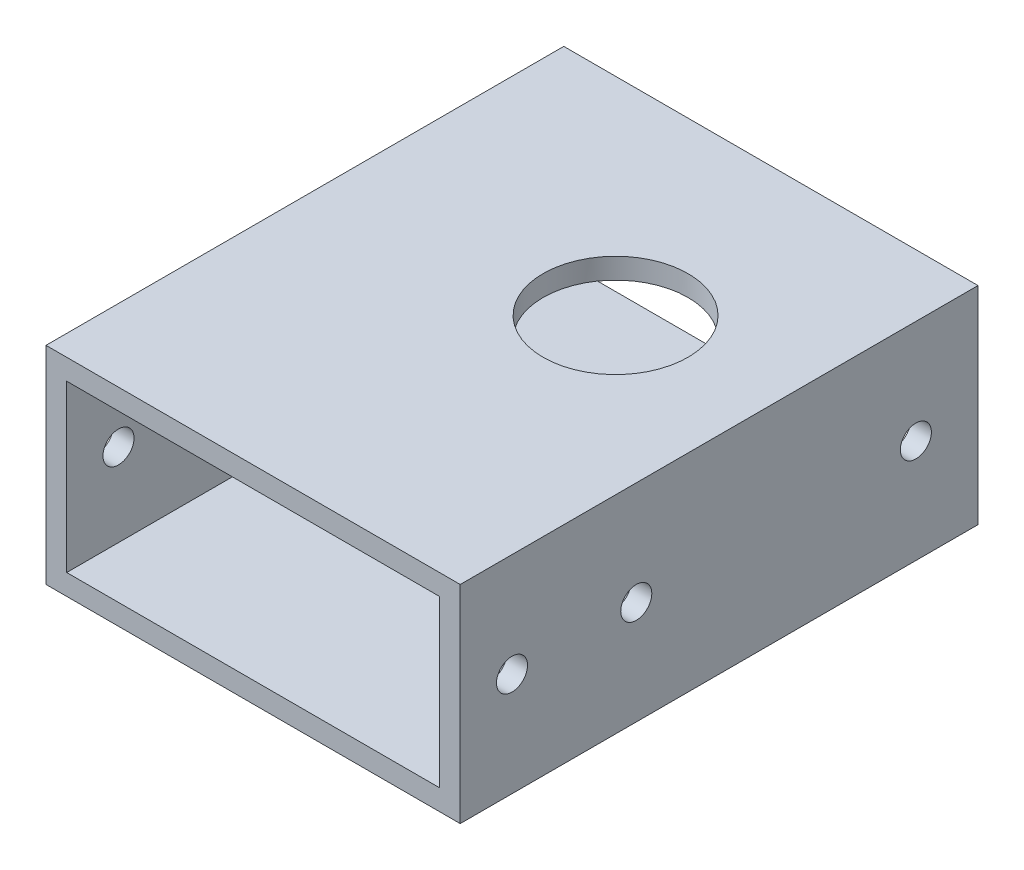
ISO-10303-21;
HEADER;
FILE_DESCRIPTION(('STEP AP214'),'2;1');
FILE_NAME('part.step','',(''),(''),'','','');
FILE_SCHEMA(('AUTOMOTIVE_DESIGN { 1 0 10303 214 1 1 1 1 }'));
ENDSEC;
DATA;
#1=APPLICATION_CONTEXT('core data for automotive mechanical design processes');
#2=APPLICATION_PROTOCOL_DEFINITION('international standard','automotive_design',2000,#1);
#3=PRODUCT_CONTEXT('',#1,'mechanical');
#4=PRODUCT('Part','Part','',(#3));
#5=PRODUCT_RELATED_PRODUCT_CATEGORY('part','',(#4));
#6=PRODUCT_DEFINITION_FORMATION('','',#4);
#7=PRODUCT_DEFINITION_CONTEXT('part definition',#1,'design');
#8=PRODUCT_DEFINITION('design','',#6,#7);
#9=PRODUCT_DEFINITION_SHAPE('','',#8);
#10=(LENGTH_UNIT() NAMED_UNIT(*) SI_UNIT(.MILLI.,.METRE.));
#11=(NAMED_UNIT(*) PLANE_ANGLE_UNIT() SI_UNIT($,.RADIAN.));
#12=(NAMED_UNIT(*) SI_UNIT($,.STERADIAN.) SOLID_ANGLE_UNIT());
#13=UNCERTAINTY_MEASURE_WITH_UNIT(LENGTH_MEASURE(1.E-05),#10,'distance_accuracy_value','');
#14=(GEOMETRIC_REPRESENTATION_CONTEXT(3) GLOBAL_UNCERTAINTY_ASSIGNED_CONTEXT((#13)) GLOBAL_UNIT_ASSIGNED_CONTEXT((#10,
#11,#12)) REPRESENTATION_CONTEXT('',''));
#15=CARTESIAN_POINT('',(0.,0.,0.));
#16=DIRECTION('',(0.,0.,1.));
#17=DIRECTION('',(1.,0.,0.));
#18=AXIS2_PLACEMENT_3D('',#15,#16,#17);
#19=CARTESIAN_POINT('',(0.,0.,50.));
#20=DIRECTION('',(0.,0.,1.));
#21=DIRECTION('',(1.,0.,0.));
#22=AXIS2_PLACEMENT_3D('',#19,#20,#21);
#23=PLANE('',#22);
#24=DIRECTION('',(0.,1.,0.));
#25=VECTOR('',#24,1.);
#26=CARTESIAN_POINT('',(20.,10.,50.));
#27=LINE('',#26,#25);
#28=CARTESIAN_POINT('',(20.,-10.,50.));
#29=VERTEX_POINT('',#28);
#30=CARTESIAN_POINT('',(20.,10.,50.));
#31=VERTEX_POINT('',#30);
#32=EDGE_CURVE('E148',#29,#31,#27,.T.);
#33=ORIENTED_EDGE('',*,*,#32,.T.);
#34=DIRECTION('',(-1.,0.,0.));
#35=VECTOR('',#34,1.);
#36=CARTESIAN_POINT('',(-20.,10.,50.));
#37=LINE('',#36,#35);
#38=CARTESIAN_POINT('',(-20.,10.,50.));
#39=VERTEX_POINT('',#38);
#40=EDGE_CURVE('E149',#31,#39,#37,.T.);
#41=ORIENTED_EDGE('',*,*,#40,.T.);
#42=DIRECTION('',(0.,-1.,0.));
#43=VECTOR('',#42,1.);
#44=CARTESIAN_POINT('',(-20.,10.,50.));
#45=LINE('',#44,#43);
#46=CARTESIAN_POINT('',(-20.,-10.,50.));
#47=VERTEX_POINT('',#46);
#48=EDGE_CURVE('E155',#39,#47,#45,.T.);
#49=ORIENTED_EDGE('',*,*,#48,.T.);
#50=DIRECTION('',(1.,0.,0.));
#51=VECTOR('',#50,1.);
#52=CARTESIAN_POINT('',(-20.,-10.,50.));
#53=LINE('',#52,#51);
#54=EDGE_CURVE('E152',#47,#29,#53,.T.);
#55=ORIENTED_EDGE('',*,*,#54,.T.);
#56=EDGE_LOOP('',(#33,#41,#49,#55));
#57=FACE_BOUND('',#56,.T.);
#58=DIRECTION('',(-1.,0.,0.));
#59=VECTOR('',#58,1.);
#60=CARTESIAN_POINT('',(-18.,8.,50.));
#61=LINE('',#60,#59);
#62=CARTESIAN_POINT('',(18.,8.,50.));
#63=VERTEX_POINT('',#62);
#64=CARTESIAN_POINT('',(-18.,8.,50.));
#65=VERTEX_POINT('',#64);
#66=EDGE_CURVE('E118',#63,#65,#61,.T.);
#67=ORIENTED_EDGE('',*,*,#66,.F.);
#68=DIRECTION('',(0.,1.,0.));
#69=VECTOR('',#68,1.);
#70=CARTESIAN_POINT('',(18.,8.,50.));
#71=LINE('',#70,#69);
#72=CARTESIAN_POINT('',(18.,-8.00000000000001,50.));
#73=VERTEX_POINT('',#72);
#74=EDGE_CURVE('E107',#73,#63,#71,.T.);
#75=ORIENTED_EDGE('',*,*,#74,.F.);
#76=DIRECTION('',(1.,0.,0.));
#77=VECTOR('',#76,1.);
#78=CARTESIAN_POINT('',(-18.,-8.00000000000001,50.));
#79=LINE('',#78,#77);
#80=CARTESIAN_POINT('',(-18.,-8.00000000000001,50.));
#81=VERTEX_POINT('',#80);
#82=EDGE_CURVE('E128',#81,#73,#79,.T.);
#83=ORIENTED_EDGE('',*,*,#82,.F.);
#84=DIRECTION('',(0.,-1.,0.));
#85=VECTOR('',#84,1.);
#86=CARTESIAN_POINT('',(-18.,8.,50.));
#87=LINE('',#86,#85);
#88=EDGE_CURVE('E126',#65,#81,#87,.T.);
#89=ORIENTED_EDGE('',*,*,#88,.F.);
#90=EDGE_LOOP('',(#67,#75,#83,#89));
#91=FACE_BOUND('',#90,.T.);
#92=ADVANCED_FACE('F41',(#57,#91),#23,.T.);
#93=CARTESIAN_POINT('',(0.,0.,0.));
#94=DIRECTION('',(0.,0.,1.));
#95=DIRECTION('',(1.,0.,0.));
#96=AXIS2_PLACEMENT_3D('',#93,#94,#95);
#97=PLANE('',#96);
#98=DIRECTION('',(0.,1.,0.));
#99=VECTOR('',#98,1.);
#100=CARTESIAN_POINT('',(20.,10.,0.));
#101=LINE('',#100,#99);
#102=CARTESIAN_POINT('',(20.,-10.,0.));
#103=VERTEX_POINT('',#102);
#104=CARTESIAN_POINT('',(20.,10.,0.));
#105=VERTEX_POINT('',#104);
#106=EDGE_CURVE('E124',#103,#105,#101,.T.);
#107=ORIENTED_EDGE('',*,*,#106,.F.);
#108=DIRECTION('',(1.,0.,0.));
#109=VECTOR('',#108,1.);
#110=CARTESIAN_POINT('',(-20.,-10.,0.));
#111=LINE('',#110,#109);
#112=CARTESIAN_POINT('',(-20.,-10.,0.));
#113=VERTEX_POINT('',#112);
#114=EDGE_CURVE('E147',#113,#103,#111,.T.);
#115=ORIENTED_EDGE('',*,*,#114,.F.);
#116=DIRECTION('',(0.,-1.,0.));
#117=VECTOR('',#116,1.);
#118=CARTESIAN_POINT('',(-20.,10.,0.));
#119=LINE('',#118,#117);
#120=CARTESIAN_POINT('',(-20.,10.,0.));
#121=VERTEX_POINT('',#120);
#122=EDGE_CURVE('E161',#121,#113,#119,.T.);
#123=ORIENTED_EDGE('',*,*,#122,.F.);
#124=DIRECTION('',(-1.,0.,0.));
#125=VECTOR('',#124,1.);
#126=CARTESIAN_POINT('',(-20.,10.,0.));
#127=LINE('',#126,#125);
#128=EDGE_CURVE('E157',#105,#121,#127,.T.);
#129=ORIENTED_EDGE('',*,*,#128,.F.);
#130=EDGE_LOOP('',(#107,#115,#123,#129));
#131=FACE_BOUND('',#130,.T.);
#132=DIRECTION('',(0.,1.,0.));
#133=VECTOR('',#132,1.);
#134=CARTESIAN_POINT('',(18.,8.,0.));
#135=LINE('',#134,#133);
#136=CARTESIAN_POINT('',(18.,-8.00000000000001,0.));
#137=VERTEX_POINT('',#136);
#138=CARTESIAN_POINT('',(18.,8.,0.));
#139=VERTEX_POINT('',#138);
#140=EDGE_CURVE('E68',#137,#139,#135,.T.);
#141=ORIENTED_EDGE('',*,*,#140,.T.);
#142=DIRECTION('',(-1.,0.,0.));
#143=VECTOR('',#142,1.);
#144=CARTESIAN_POINT('',(-18.,8.,0.));
#145=LINE('',#144,#143);
#146=CARTESIAN_POINT('',(-18.,8.,0.));
#147=VERTEX_POINT('',#146);
#148=EDGE_CURVE('E121',#139,#147,#145,.T.);
#149=ORIENTED_EDGE('',*,*,#148,.T.);
#150=DIRECTION('',(0.,-1.,0.));
#151=VECTOR('',#150,1.);
#152=CARTESIAN_POINT('',(-18.,8.,0.));
#153=LINE('',#152,#151);
#154=CARTESIAN_POINT('',(-18.,-8.00000000000001,0.));
#155=VERTEX_POINT('',#154);
#156=EDGE_CURVE('E136',#147,#155,#153,.T.);
#157=ORIENTED_EDGE('',*,*,#156,.T.);
#158=DIRECTION('',(1.,0.,0.));
#159=VECTOR('',#158,1.);
#160=CARTESIAN_POINT('',(-18.,-8.00000000000001,0.));
#161=LINE('',#160,#159);
#162=EDGE_CURVE('E119',#155,#137,#161,.T.);
#163=ORIENTED_EDGE('',*,*,#162,.T.);
#164=EDGE_LOOP('',(#141,#149,#157,#163));
#165=FACE_BOUND('',#164,.T.);
#166=ADVANCED_FACE('F226',(#131,#165),#97,.F.);
#167=CARTESIAN_POINT('',(20.,10.,50.));
#168=DIRECTION('',(-1.,0.,0.));
#169=DIRECTION('',(0.,-1.,0.));
#170=AXIS2_PLACEMENT_3D('',#167,#168,#169);
#171=PLANE('',#170);
#172=CARTESIAN_POINT('',(20.,0.,6.));
#173=DIRECTION('',(1.,0.,0.));
#174=DIRECTION('',(0.,1.,0.));
#175=AXIS2_PLACEMENT_3D('',#172,#173,#174);
#176=CIRCLE('',#175,1.5);
#177=CARTESIAN_POINT('',(20.,1.50000000000001,6.));
#178=VERTEX_POINT('',#177);
#179=EDGE_CURVE('E176',#178,#178,#176,.T.);
#180=ORIENTED_EDGE('',*,*,#179,.F.);
#181=EDGE_LOOP('',(#180));
#182=FACE_BOUND('',#181,.T.);
#183=CARTESIAN_POINT('',(20.,0.,33.));
#184=DIRECTION('',(1.,0.,0.));
#185=DIRECTION('',(0.,1.,0.));
#186=AXIS2_PLACEMENT_3D('',#183,#184,#185);
#187=CIRCLE('',#186,1.5);
#188=CARTESIAN_POINT('',(20.,1.50000000000001,33.));
#189=VERTEX_POINT('',#188);
#190=EDGE_CURVE('E307',#189,#189,#187,.T.);
#191=ORIENTED_EDGE('',*,*,#190,.F.);
#192=EDGE_LOOP('',(#191));
#193=FACE_BOUND('',#192,.T.);
#194=CARTESIAN_POINT('',(20.,0.,45.));
#195=DIRECTION('',(1.,0.,0.));
#196=DIRECTION('',(0.,1.,0.));
#197=AXIS2_PLACEMENT_3D('',#194,#195,#196);
#198=CIRCLE('',#197,1.5);
#199=CARTESIAN_POINT('',(20.,1.50000000000001,45.));
#200=VERTEX_POINT('',#199);
#201=EDGE_CURVE('E309',#200,#200,#198,.T.);
#202=ORIENTED_EDGE('',*,*,#201,.F.);
#203=EDGE_LOOP('',(#202));
#204=FACE_BOUND('',#203,.T.);
#205=ORIENTED_EDGE('',*,*,#106,.T.);
#206=DIRECTION('',(0.,0.,-1.));
#207=VECTOR('',#206,1.);
#208=CARTESIAN_POINT('',(20.,10.,50.));
#209=LINE('',#208,#207);
#210=EDGE_CURVE('E11',#31,#105,#209,.T.);
#211=ORIENTED_EDGE('',*,*,#210,.F.);
#212=ORIENTED_EDGE('',*,*,#32,.F.);
#213=DIRECTION('',(0.,0.,-1.));
#214=VECTOR('',#213,1.);
#215=CARTESIAN_POINT('',(20.,-10.,50.));
#216=LINE('',#215,#214);
#217=EDGE_CURVE('E156',#29,#103,#216,.T.);
#218=ORIENTED_EDGE('',*,*,#217,.T.);
#219=EDGE_LOOP('',(#205,#211,#212,#218));
#220=FACE_BOUND('',#219,.T.);
#221=ADVANCED_FACE('F43',(#182,#193,#204,#220),#171,.F.);
#222=CARTESIAN_POINT('',(-20.,10.,50.));
#223=DIRECTION('',(0.,-1.,0.));
#224=DIRECTION('',(0.,0.,-1.));
#225=AXIS2_PLACEMENT_3D('',#222,#223,#224);
#226=PLANE('',#225);
#227=CARTESIAN_POINT('',(5.,10.,20.));
#228=DIRECTION('',(0.,1.,0.));
#229=DIRECTION('',(0.,0.,1.));
#230=AXIS2_PLACEMENT_3D('',#227,#228,#229);
#231=CIRCLE('',#230,7.);
#232=CARTESIAN_POINT('',(5.,10.,27.));
#233=VERTEX_POINT('',#232);
#234=EDGE_CURVE('E204',#233,#233,#231,.T.);
#235=ORIENTED_EDGE('',*,*,#234,.F.);
#236=EDGE_LOOP('',(#235));
#237=FACE_BOUND('',#236,.T.);
#238=ORIENTED_EDGE('',*,*,#128,.T.);
#239=DIRECTION('',(0.,0.,-1.));
#240=VECTOR('',#239,1.);
#241=CARTESIAN_POINT('',(-20.,10.,50.));
#242=LINE('',#241,#240);
#243=EDGE_CURVE('E49',#39,#121,#242,.T.);
#244=ORIENTED_EDGE('',*,*,#243,.F.);
#245=ORIENTED_EDGE('',*,*,#40,.F.);
#246=ORIENTED_EDGE('',*,*,#210,.T.);
#247=EDGE_LOOP('',(#238,#244,#245,#246));
#248=FACE_BOUND('',#247,.T.);
#249=ADVANCED_FACE('F242',(#237,#248),#226,.F.);
#250=CARTESIAN_POINT('',(-20.,10.,50.));
#251=DIRECTION('',(1.,0.,0.));
#252=DIRECTION('',(0.,1.,0.));
#253=AXIS2_PLACEMENT_3D('',#250,#251,#252);
#254=PLANE('',#253);
#255=CARTESIAN_POINT('',(-20.,0.,6.));
#256=DIRECTION('',(1.,0.,0.));
#257=DIRECTION('',(0.,1.,0.));
#258=AXIS2_PLACEMENT_3D('',#255,#256,#257);
#259=CIRCLE('',#258,1.5);
#260=CARTESIAN_POINT('',(-20.,1.49999999999999,6.));
#261=VERTEX_POINT('',#260);
#262=EDGE_CURVE('E203',#261,#261,#259,.T.);
#263=ORIENTED_EDGE('',*,*,#262,.T.);
#264=EDGE_LOOP('',(#263));
#265=FACE_BOUND('',#264,.T.);
#266=CARTESIAN_POINT('',(-20.,0.,33.));
#267=DIRECTION('',(1.,0.,0.));
#268=DIRECTION('',(0.,1.,0.));
#269=AXIS2_PLACEMENT_3D('',#266,#267,#268);
#270=CIRCLE('',#269,1.5);
#271=CARTESIAN_POINT('',(-20.,1.5,33.));
#272=VERTEX_POINT('',#271);
#273=EDGE_CURVE('E188',#272,#272,#270,.T.);
#274=ORIENTED_EDGE('',*,*,#273,.T.);
#275=EDGE_LOOP('',(#274));
#276=FACE_BOUND('',#275,.T.);
#277=CARTESIAN_POINT('',(-20.,0.,45.));
#278=DIRECTION('',(1.,0.,0.));
#279=DIRECTION('',(0.,1.,0.));
#280=AXIS2_PLACEMENT_3D('',#277,#278,#279);
#281=CIRCLE('',#280,1.5);
#282=CARTESIAN_POINT('',(-20.,1.5,45.));
#283=VERTEX_POINT('',#282);
#284=EDGE_CURVE('E185',#283,#283,#281,.T.);
#285=ORIENTED_EDGE('',*,*,#284,.T.);
#286=EDGE_LOOP('',(#285));
#287=FACE_BOUND('',#286,.T.);
#288=ORIENTED_EDGE('',*,*,#122,.T.);
#289=DIRECTION('',(0.,0.,-1.));
#290=VECTOR('',#289,1.);
#291=CARTESIAN_POINT('',(-20.,-10.,50.));
#292=LINE('',#291,#290);
#293=EDGE_CURVE('E167',#47,#113,#292,.T.);
#294=ORIENTED_EDGE('',*,*,#293,.F.);
#295=ORIENTED_EDGE('',*,*,#48,.F.);
#296=ORIENTED_EDGE('',*,*,#243,.T.);
#297=EDGE_LOOP('',(#288,#294,#295,#296));
#298=FACE_BOUND('',#297,.T.);
#299=ADVANCED_FACE('F238',(#265,#276,#287,#298),#254,.F.);
#300=CARTESIAN_POINT('',(-20.,-10.,50.));
#301=DIRECTION('',(0.,1.,0.));
#302=DIRECTION('',(0.,0.,1.));
#303=AXIS2_PLACEMENT_3D('',#300,#301,#302);
#304=PLANE('',#303);
#305=CARTESIAN_POINT('',(5.,-10.,20.));
#306=DIRECTION('',(0.,1.,0.));
#307=DIRECTION('',(0.,0.,1.));
#308=AXIS2_PLACEMENT_3D('',#305,#306,#307);
#309=CIRCLE('',#308,7.);
#310=CARTESIAN_POINT('',(5.,-10.,27.));
#311=VERTEX_POINT('',#310);
#312=EDGE_CURVE('E175',#311,#311,#309,.T.);
#313=ORIENTED_EDGE('',*,*,#312,.T.);
#314=EDGE_LOOP('',(#313));
#315=FACE_BOUND('',#314,.T.);
#316=ORIENTED_EDGE('',*,*,#114,.T.);
#317=ORIENTED_EDGE('',*,*,#217,.F.);
#318=ORIENTED_EDGE('',*,*,#54,.F.);
#319=ORIENTED_EDGE('',*,*,#293,.T.);
#320=EDGE_LOOP('',(#316,#317,#318,#319));
#321=FACE_BOUND('',#320,.T.);
#322=ADVANCED_FACE('F228',(#315,#321),#304,.F.);
#323=CARTESIAN_POINT('',(18.,8.,50.));
#324=DIRECTION('',(-1.,0.,0.));
#325=DIRECTION('',(0.,0.,1.));
#326=AXIS2_PLACEMENT_3D('',#323,#324,#325);
#327=PLANE('',#326);
#328=CARTESIAN_POINT('',(18.,0.,6.));
#329=DIRECTION('',(-1.,0.,0.));
#330=DIRECTION('',(0.,0.,1.));
#331=AXIS2_PLACEMENT_3D('',#328,#329,#330);
#332=CIRCLE('',#331,1.5);
#333=CARTESIAN_POINT('',(18.,0.,7.5));
#334=VERTEX_POINT('',#333);
#335=EDGE_CURVE('E196',#334,#334,#332,.T.);
#336=ORIENTED_EDGE('',*,*,#335,.F.);
#337=EDGE_LOOP('',(#336));
#338=FACE_BOUND('',#337,.T.);
#339=CARTESIAN_POINT('',(18.,0.,33.));
#340=DIRECTION('',(-1.,0.,0.));
#341=DIRECTION('',(0.,0.,1.));
#342=AXIS2_PLACEMENT_3D('',#339,#340,#341);
#343=CIRCLE('',#342,1.5);
#344=CARTESIAN_POINT('',(18.,0.,34.5));
#345=VERTEX_POINT('',#344);
#346=EDGE_CURVE('E182',#345,#345,#343,.T.);
#347=ORIENTED_EDGE('',*,*,#346,.F.);
#348=EDGE_LOOP('',(#347));
#349=FACE_BOUND('',#348,.T.);
#350=CARTESIAN_POINT('',(18.,0.,45.));
#351=DIRECTION('',(-1.,0.,0.));
#352=DIRECTION('',(0.,0.,1.));
#353=AXIS2_PLACEMENT_3D('',#350,#351,#352);
#354=CIRCLE('',#353,1.5);
#355=CARTESIAN_POINT('',(18.,0.,46.5));
#356=VERTEX_POINT('',#355);
#357=EDGE_CURVE('E180',#356,#356,#354,.T.);
#358=ORIENTED_EDGE('',*,*,#357,.F.);
#359=EDGE_LOOP('',(#358));
#360=FACE_BOUND('',#359,.T.);
#361=ORIENTED_EDGE('',*,*,#140,.F.);
#362=DIRECTION('',(0.,0.,-1.));
#363=VECTOR('',#362,1.);
#364=CARTESIAN_POINT('',(18.,-8.00000000000001,50.));
#365=LINE('',#364,#363);
#366=EDGE_CURVE('E115',#73,#137,#365,.T.);
#367=ORIENTED_EDGE('',*,*,#366,.F.);
#368=ORIENTED_EDGE('',*,*,#74,.T.);
#369=DIRECTION('',(0.,0.,-1.));
#370=VECTOR('',#369,1.);
#371=CARTESIAN_POINT('',(18.,8.,50.));
#372=LINE('',#371,#370);
#373=EDGE_CURVE('E112',#63,#139,#372,.T.);
#374=ORIENTED_EDGE('',*,*,#373,.T.);
#375=EDGE_LOOP('',(#361,#367,#368,#374));
#376=FACE_BOUND('',#375,.T.);
#377=ADVANCED_FACE('F109',(#338,#349,#360,#376),#327,.T.);
#378=CARTESIAN_POINT('',(-18.,8.,50.));
#379=DIRECTION('',(0.,-1.,0.));
#380=DIRECTION('',(0.,0.,-1.));
#381=AXIS2_PLACEMENT_3D('',#378,#379,#380);
#382=PLANE('',#381);
#383=CARTESIAN_POINT('',(5.,8.,20.));
#384=DIRECTION('',(0.,-1.,0.));
#385=DIRECTION('',(0.,0.,-1.));
#386=AXIS2_PLACEMENT_3D('',#383,#384,#385);
#387=CIRCLE('',#386,7.);
#388=CARTESIAN_POINT('',(5.,8.,13.));
#389=VERTEX_POINT('',#388);
#390=EDGE_CURVE('E138',#389,#389,#387,.T.);
#391=ORIENTED_EDGE('',*,*,#390,.F.);
#392=EDGE_LOOP('',(#391));
#393=FACE_BOUND('',#392,.T.);
#394=ORIENTED_EDGE('',*,*,#148,.F.);
#395=ORIENTED_EDGE('',*,*,#373,.F.);
#396=ORIENTED_EDGE('',*,*,#66,.T.);
#397=DIRECTION('',(0.,0.,-1.));
#398=VECTOR('',#397,1.);
#399=CARTESIAN_POINT('',(-18.,8.,50.));
#400=LINE('',#399,#398);
#401=EDGE_CURVE('E122',#65,#147,#400,.T.);
#402=ORIENTED_EDGE('',*,*,#401,.T.);
#403=EDGE_LOOP('',(#394,#395,#396,#402));
#404=FACE_BOUND('',#403,.T.);
#405=ADVANCED_FACE('F116',(#393,#404),#382,.T.);
#406=CARTESIAN_POINT('',(-18.,8.,50.));
#407=DIRECTION('',(1.,0.,0.));
#408=DIRECTION('',(0.,0.,-1.));
#409=AXIS2_PLACEMENT_3D('',#406,#407,#408);
#410=PLANE('',#409);
#411=CARTESIAN_POINT('',(-18.,0.,6.));
#412=DIRECTION('',(1.,0.,0.));
#413=DIRECTION('',(0.,0.,-1.));
#414=AXIS2_PLACEMENT_3D('',#411,#412,#413);
#415=CIRCLE('',#414,1.5);
#416=CARTESIAN_POINT('',(-18.,0.,4.5));
#417=VERTEX_POINT('',#416);
#418=EDGE_CURVE('E44',#417,#417,#415,.T.);
#419=ORIENTED_EDGE('',*,*,#418,.F.);
#420=EDGE_LOOP('',(#419));
#421=FACE_BOUND('',#420,.T.);
#422=CARTESIAN_POINT('',(-18.,0.,33.));
#423=DIRECTION('',(1.,0.,0.));
#424=DIRECTION('',(0.,0.,-1.));
#425=AXIS2_PLACEMENT_3D('',#422,#423,#424);
#426=CIRCLE('',#425,1.5);
#427=CARTESIAN_POINT('',(-18.,0.,31.5));
#428=VERTEX_POINT('',#427);
#429=EDGE_CURVE('E179',#428,#428,#426,.T.);
#430=ORIENTED_EDGE('',*,*,#429,.F.);
#431=EDGE_LOOP('',(#430));
#432=FACE_BOUND('',#431,.T.);
#433=CARTESIAN_POINT('',(-18.,0.,45.));
#434=DIRECTION('',(1.,0.,0.));
#435=DIRECTION('',(0.,0.,-1.));
#436=AXIS2_PLACEMENT_3D('',#433,#434,#435);
#437=CIRCLE('',#436,1.5);
#438=CARTESIAN_POINT('',(-18.,0.,43.5));
#439=VERTEX_POINT('',#438);
#440=EDGE_CURVE('E171',#439,#439,#437,.T.);
#441=ORIENTED_EDGE('',*,*,#440,.F.);
#442=EDGE_LOOP('',(#441));
#443=FACE_BOUND('',#442,.T.);
#444=ORIENTED_EDGE('',*,*,#156,.F.);
#445=ORIENTED_EDGE('',*,*,#401,.F.);
#446=ORIENTED_EDGE('',*,*,#88,.T.);
#447=DIRECTION('',(0.,0.,-1.));
#448=VECTOR('',#447,1.);
#449=CARTESIAN_POINT('',(-18.,-8.00000000000001,50.));
#450=LINE('',#449,#448);
#451=EDGE_CURVE('E59',#81,#155,#450,.T.);
#452=ORIENTED_EDGE('',*,*,#451,.T.);
#453=EDGE_LOOP('',(#444,#445,#446,#452));
#454=FACE_BOUND('',#453,.T.);
#455=ADVANCED_FACE('F214',(#421,#432,#443,#454),#410,.T.);
#456=CARTESIAN_POINT('',(-18.,-8.00000000000001,50.));
#457=DIRECTION('',(0.,1.,0.));
#458=DIRECTION('',(0.,0.,1.));
#459=AXIS2_PLACEMENT_3D('',#456,#457,#458);
#460=PLANE('',#459);
#461=CARTESIAN_POINT('',(5.,-8.00000000000001,20.));
#462=DIRECTION('',(0.,1.,0.));
#463=DIRECTION('',(0.,0.,1.));
#464=AXIS2_PLACEMENT_3D('',#461,#462,#463);
#465=CIRCLE('',#464,7.);
#466=CARTESIAN_POINT('',(5.,-8.00000000000001,27.));
#467=VERTEX_POINT('',#466);
#468=EDGE_CURVE('E173',#467,#467,#465,.T.);
#469=ORIENTED_EDGE('',*,*,#468,.F.);
#470=EDGE_LOOP('',(#469));
#471=FACE_BOUND('',#470,.T.);
#472=ORIENTED_EDGE('',*,*,#162,.F.);
#473=ORIENTED_EDGE('',*,*,#451,.F.);
#474=ORIENTED_EDGE('',*,*,#82,.T.);
#475=ORIENTED_EDGE('',*,*,#366,.T.);
#476=EDGE_LOOP('',(#472,#473,#474,#475));
#477=FACE_BOUND('',#476,.T.);
#478=ADVANCED_FACE('F225',(#471,#477),#460,.T.);
#479=CARTESIAN_POINT('',(5.,-10.,20.));
#480=DIRECTION('',(0.,1.,0.));
#481=DIRECTION('',(0.,0.,1.));
#482=AXIS2_PLACEMENT_3D('',#479,#480,#481);
#483=CYLINDRICAL_SURFACE('',#482,7.);
#484=ORIENTED_EDGE('',*,*,#468,.T.);
#485=EDGE_LOOP('',(#484));
#486=FACE_BOUND('',#485,.T.);
#487=ORIENTED_EDGE('',*,*,#312,.F.);
#488=EDGE_LOOP('',(#487));
#489=FACE_BOUND('',#488,.T.);
#490=ADVANCED_FACE('F268',(#486,#489),#483,.F.);
#491=ORIENTED_EDGE('',*,*,#390,.T.);
#492=EDGE_LOOP('',(#491));
#493=FACE_BOUND('',#492,.T.);
#494=ORIENTED_EDGE('',*,*,#234,.T.);
#495=EDGE_LOOP('',(#494));
#496=FACE_BOUND('',#495,.T.);
#497=ADVANCED_FACE('F211',(#493,#496),#483,.F.);
#498=CARTESIAN_POINT('',(-30.,0.,45.));
#499=DIRECTION('',(1.,0.,0.));
#500=DIRECTION('',(0.,1.,0.));
#501=AXIS2_PLACEMENT_3D('',#498,#499,#500);
#502=CYLINDRICAL_SURFACE('',#501,1.5);
#503=ORIENTED_EDGE('',*,*,#440,.T.);
#504=EDGE_LOOP('',(#503));
#505=FACE_BOUND('',#504,.T.);
#506=ORIENTED_EDGE('',*,*,#284,.F.);
#507=EDGE_LOOP('',(#506));
#508=FACE_BOUND('',#507,.T.);
#509=ADVANCED_FACE('F279',(#505,#508),#502,.F.);
#510=CARTESIAN_POINT('',(-30.,0.,33.));
#511=DIRECTION('',(1.,0.,0.));
#512=DIRECTION('',(0.,1.,0.));
#513=AXIS2_PLACEMENT_3D('',#510,#511,#512);
#514=CYLINDRICAL_SURFACE('',#513,1.5);
#515=ORIENTED_EDGE('',*,*,#429,.T.);
#516=EDGE_LOOP('',(#515));
#517=FACE_BOUND('',#516,.T.);
#518=ORIENTED_EDGE('',*,*,#273,.F.);
#519=EDGE_LOOP('',(#518));
#520=FACE_BOUND('',#519,.T.);
#521=ADVANCED_FACE('F283',(#517,#520),#514,.F.);
#522=CARTESIAN_POINT('',(-30.,0.,6.));
#523=DIRECTION('',(1.,0.,0.));
#524=DIRECTION('',(0.,1.,0.));
#525=AXIS2_PLACEMENT_3D('',#522,#523,#524);
#526=CYLINDRICAL_SURFACE('',#525,1.5);
#527=ORIENTED_EDGE('',*,*,#418,.T.);
#528=EDGE_LOOP('',(#527));
#529=FACE_BOUND('',#528,.T.);
#530=ORIENTED_EDGE('',*,*,#262,.F.);
#531=EDGE_LOOP('',(#530));
#532=FACE_BOUND('',#531,.T.);
#533=ADVANCED_FACE('F288',(#529,#532),#526,.F.);
#534=ORIENTED_EDGE('',*,*,#357,.T.);
#535=EDGE_LOOP('',(#534));
#536=FACE_BOUND('',#535,.T.);
#537=ORIENTED_EDGE('',*,*,#201,.T.);
#538=EDGE_LOOP('',(#537));
#539=FACE_BOUND('',#538,.T.);
#540=ADVANCED_FACE('F282',(#536,#539),#502,.F.);
#541=ORIENTED_EDGE('',*,*,#346,.T.);
#542=EDGE_LOOP('',(#541));
#543=FACE_BOUND('',#542,.T.);
#544=ORIENTED_EDGE('',*,*,#190,.T.);
#545=EDGE_LOOP('',(#544));
#546=FACE_BOUND('',#545,.T.);
#547=ADVANCED_FACE('F290',(#543,#546),#514,.F.);
#548=ORIENTED_EDGE('',*,*,#335,.T.);
#549=EDGE_LOOP('',(#548));
#550=FACE_BOUND('',#549,.T.);
#551=ORIENTED_EDGE('',*,*,#179,.T.);
#552=EDGE_LOOP('',(#551));
#553=FACE_BOUND('',#552,.T.);
#554=ADVANCED_FACE('F287',(#550,#553),#526,.F.);
#555=CLOSED_SHELL('',(#92,#166,#221,#249,#299,#322,#377,#405,#455,#478,#490,#497,#509,#521,#533,
#540,#547,#554));
#556=MANIFOLD_SOLID_BREP('B2',#555);
#557=ADVANCED_BREP_SHAPE_REPRESENTATION('',(#18,#556),#14);
#558=SHAPE_DEFINITION_REPRESENTATION(#9,#557);
ENDSEC;
END-ISO-10303-21;
